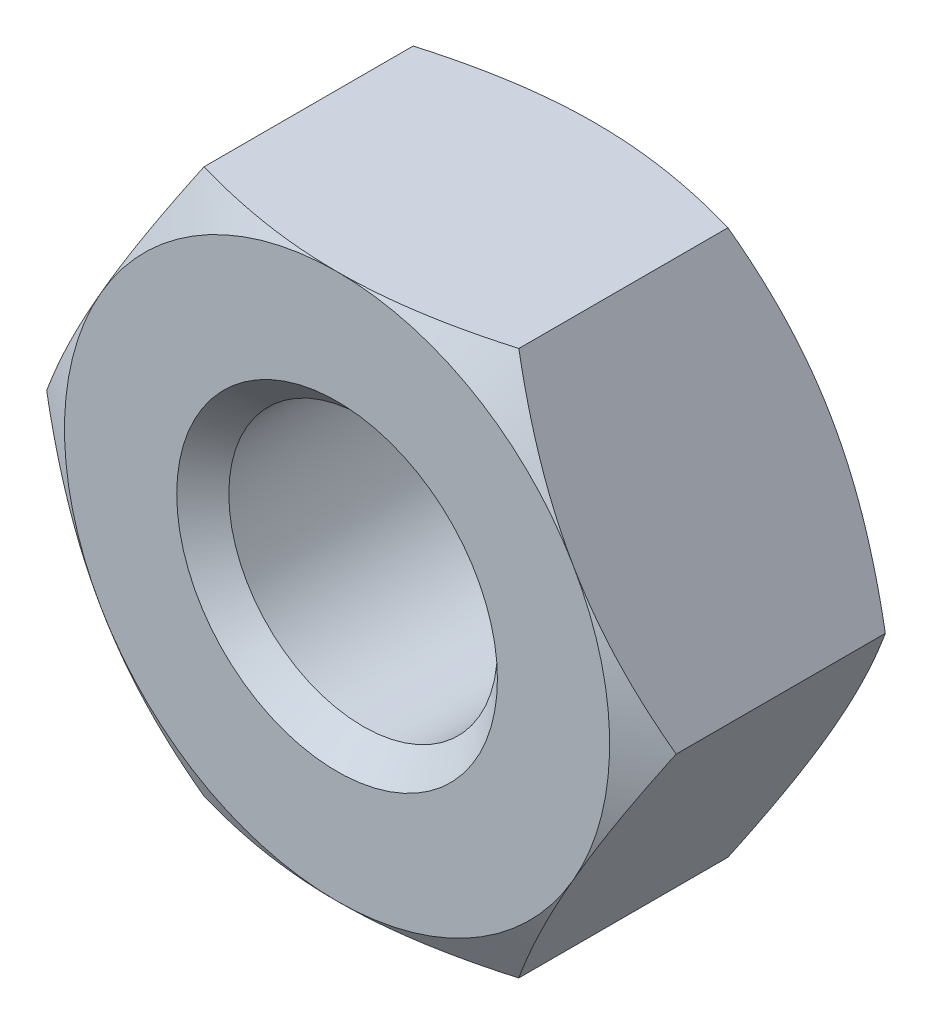
ISO-10303-21;
HEADER;
FILE_DESCRIPTION(('STEP AP214'),'2;1');
FILE_NAME('part.step','',(''),(''),'','','');
FILE_SCHEMA(('AUTOMOTIVE_DESIGN { 1 0 10303 214 1 1 1 1 }'));
ENDSEC;
DATA;
#1=APPLICATION_CONTEXT('core data for automotive mechanical design processes');
#2=APPLICATION_PROTOCOL_DEFINITION('international standard','automotive_design',2000,#1);
#3=PRODUCT_CONTEXT('',#1,'mechanical');
#4=PRODUCT('Part','Part','',(#3));
#5=PRODUCT_RELATED_PRODUCT_CATEGORY('part','',(#4));
#6=PRODUCT_DEFINITION_FORMATION('','',#4);
#7=PRODUCT_DEFINITION_CONTEXT('part definition',#1,'design');
#8=PRODUCT_DEFINITION('design','',#6,#7);
#9=PRODUCT_DEFINITION_SHAPE('','',#8);
#10=(LENGTH_UNIT() NAMED_UNIT(*) SI_UNIT(.MILLI.,.METRE.));
#11=(NAMED_UNIT(*) PLANE_ANGLE_UNIT() SI_UNIT($,.RADIAN.));
#12=(NAMED_UNIT(*) SI_UNIT($,.STERADIAN.) SOLID_ANGLE_UNIT());
#13=UNCERTAINTY_MEASURE_WITH_UNIT(LENGTH_MEASURE(1.E-05),#10,'distance_accuracy_value','');
#14=(GEOMETRIC_REPRESENTATION_CONTEXT(3) GLOBAL_UNCERTAINTY_ASSIGNED_CONTEXT((#13)) GLOBAL_UNIT_ASSIGNED_CONTEXT((#10,
#11,#12)) REPRESENTATION_CONTEXT('',''));
#15=CARTESIAN_POINT('',(0.,0.,0.));
#16=DIRECTION('',(0.,0.,1.));
#17=DIRECTION('',(1.,0.,0.));
#18=AXIS2_PLACEMENT_3D('',#15,#16,#17);
#19=CARTESIAN_POINT('',(0.,0.,0.380329489828666));
#20=DIRECTION('',(0.,0.,1.));
#21=DIRECTION('',(1.,0.,0.));
#22=AXIS2_PLACEMENT_3D('',#19,#20,#21);
#23=CONICAL_SURFACE('',#22,9.15875,1.0471975511966);
#24=CARTESIAN_POINT('',(4.91256615731534,-8.5,0.760658979657333));
#25=CARTESIAN_POINT('',(2.27961306603961,-8.5,0.));
#26=CARTESIAN_POINT('',(0.,-8.5,0.));
#27=CARTESIAN_POINT('',(-2.27961306603961,-8.5,0.));
#28=CARTESIAN_POINT('',(-4.91256615731535,-8.5,0.760658979657333));
#29=(BOUNDED_CURVE() B_SPLINE_CURVE(2,(#24,#25,#26,#27,#28),.UNSPECIFIED.,.F.,
.F.) B_SPLINE_CURVE_WITH_KNOTS((3,2,3),(0.,4.98381893788708,9.96763787577415),
.UNSPECIFIED.) CURVE() GEOMETRIC_REPRESENTATION_ITEM() RATIONAL_B_SPLINE_CURVE((1.,
1.03802697460134,1.,1.03802697460135,1.)) REPRESENTATION_ITEM(''));
#30=CARTESIAN_POINT('',(4.90747728811182,-8.5,0.759189378554847));
#31=VERTEX_POINT('',#30);
#32=CARTESIAN_POINT('',(0.,-8.5,0.));
#33=VERTEX_POINT('',#32);
#34=EDGE_CURVE('E193',#31,#33,#29,.T.);
#35=ORIENTED_EDGE('',*,*,#34,.T.);
#36=CARTESIAN_POINT('',(0.,0.,0.));
#37=DIRECTION('',(0.,0.,1.));
#38=DIRECTION('',(1.,0.,0.));
#39=AXIS2_PLACEMENT_3D('',#36,#37,#38);
#40=CIRCLE('',#39,8.5);
#41=CARTESIAN_POINT('',(7.36121593216773,-4.25,0.));
#42=VERTEX_POINT('',#41);
#43=EDGE_CURVE('E439',#33,#42,#40,.T.);
#44=ORIENTED_EDGE('',*,*,#43,.T.);
#45=CARTESIAN_POINT('',(9.8174990108254,0.00440709000678444,0.760658979657332));
#46=CARTESIAN_POINT('',(8.50102246518754,-2.27579717401077,0.));
#47=CARTESIAN_POINT('',(7.36121593216773,-4.25,0.));
#48=CARTESIAN_POINT('',(6.22140939914793,-6.22420282598924,0.));
#49=CARTESIAN_POINT('',(4.90493285351006,-8.50440709000679,0.760658979657332));
#50=(BOUNDED_CURVE() B_SPLINE_CURVE(2,(#45,#46,#47,#48,#49),.UNSPECIFIED.,.F.,
.F.) B_SPLINE_CURVE_WITH_KNOTS((3,2,3),(0.,4.98381893788707,9.96763787577414),
.UNSPECIFIED.) CURVE() GEOMETRIC_REPRESENTATION_ITEM() RATIONAL_B_SPLINE_CURVE((1.,
1.03802697460133,1.,1.03802697460134,1.)) REPRESENTATION_ITEM(''));
#51=EDGE_CURVE('E322',#42,#31,#50,.T.);
#52=ORIENTED_EDGE('',*,*,#51,.T.);
#53=EDGE_LOOP('',(#35,#44,#52));
#54=FACE_BOUND('',#53,.T.);
#55=ADVANCED_FACE('F17',(#54),#23,.T.);
#56=CARTESIAN_POINT('',(0.,0.,0.380329489828666));
#57=DIRECTION('',(0.,0.,1.));
#58=DIRECTION('',(1.,0.,0.));
#59=AXIS2_PLACEMENT_3D('',#56,#57,#58);
#60=CONICAL_SURFACE('',#59,9.15875,1.0471975511966);
#61=CARTESIAN_POINT('',(-4.90493285351006,-8.50440709000678,0.760658979657332));
#62=CARTESIAN_POINT('',(-6.22140939914794,-6.22420282598923,0.));
#63=CARTESIAN_POINT('',(-7.36121593216773,-4.25,0.));
#64=CARTESIAN_POINT('',(-8.50102246518752,-2.27579717401077,0.));
#65=CARTESIAN_POINT('',(-9.8174990108254,0.00440709000678777,0.760658979657331));
#66=(BOUNDED_CURVE() B_SPLINE_CURVE(2,(#61,#62,#63,#64,#65),.UNSPECIFIED.,.F.,
.F.) B_SPLINE_CURVE_WITH_KNOTS((3,2,3),(0.,4.98381893788707,9.96763787577413),
.UNSPECIFIED.) CURVE() GEOMETRIC_REPRESENTATION_ITEM() RATIONAL_B_SPLINE_CURVE((1.,
1.03802697460134,1.,1.03802697460134,1.)) REPRESENTATION_ITEM(''));
#67=CARTESIAN_POINT('',(-4.90747728811183,-8.5,0.759189378554847));
#68=VERTEX_POINT('',#67);
#69=CARTESIAN_POINT('',(-7.36121593216773,-4.25,0.));
#70=VERTEX_POINT('',#69);
#71=EDGE_CURVE('E363',#68,#70,#66,.T.);
#72=ORIENTED_EDGE('',*,*,#71,.T.);
#73=CARTESIAN_POINT('',(0.,0.,0.));
#74=DIRECTION('',(0.,0.,1.));
#75=DIRECTION('',(1.,0.,0.));
#76=AXIS2_PLACEMENT_3D('',#73,#74,#75);
#77=CIRCLE('',#76,8.5);
#78=EDGE_CURVE('E436',#70,#33,#77,.T.);
#79=ORIENTED_EDGE('',*,*,#78,.T.);
#80=CARTESIAN_POINT('',(4.91256615731534,-8.5,0.760658979657333));
#81=CARTESIAN_POINT('',(2.27961306603961,-8.5,0.));
#82=CARTESIAN_POINT('',(0.,-8.5,0.));
#83=CARTESIAN_POINT('',(-2.27961306603961,-8.5,0.));
#84=CARTESIAN_POINT('',(-4.91256615731535,-8.5,0.760658979657333));
#85=(BOUNDED_CURVE() B_SPLINE_CURVE(2,(#80,#81,#82,#83,#84),.UNSPECIFIED.,.F.,
.F.) B_SPLINE_CURVE_WITH_KNOTS((3,2,3),(0.,4.98381893788708,9.96763787577415),
.UNSPECIFIED.) CURVE() GEOMETRIC_REPRESENTATION_ITEM() RATIONAL_B_SPLINE_CURVE((1.,
1.03802697460134,1.,1.03802697460135,1.)) REPRESENTATION_ITEM(''));
#86=EDGE_CURVE('E47',#33,#68,#85,.T.);
#87=ORIENTED_EDGE('',*,*,#86,.T.);
#88=EDGE_LOOP('',(#72,#79,#87));
#89=FACE_BOUND('',#88,.T.);
#90=ADVANCED_FACE('F437',(#89),#60,.T.);
#91=CARTESIAN_POINT('',(0.,0.,0.380329489828666));
#92=DIRECTION('',(0.,0.,1.));
#93=DIRECTION('',(1.,0.,0.));
#94=AXIS2_PLACEMENT_3D('',#91,#92,#93);
#95=CONICAL_SURFACE('',#94,9.15875,1.0471975511966);
#96=CARTESIAN_POINT('',(-9.8174990108254,-0.00440709000678577,0.760658979657332));
#97=CARTESIAN_POINT('',(-8.50102246518754,2.27579717401076,0.));
#98=CARTESIAN_POINT('',(-7.36121593216773,4.25,0.));
#99=CARTESIAN_POINT('',(-6.22140939914792,6.22420282598924,0.));
#100=CARTESIAN_POINT('',(-4.90493285351005,8.50440709000679,0.760658979657331));
#101=(BOUNDED_CURVE() B_SPLINE_CURVE(2,(#96,#97,#98,#99,#100),.UNSPECIFIED.,.F.,
.F.) B_SPLINE_CURVE_WITH_KNOTS((3,2,3),(0.,4.98381893788707,9.96763787577414),
.UNSPECIFIED.) CURVE() GEOMETRIC_REPRESENTATION_ITEM() RATIONAL_B_SPLINE_CURVE((1.,
1.03802697460133,1.,1.03802697460134,1.)) REPRESENTATION_ITEM(''));
#102=CARTESIAN_POINT('',(-9.81495457622364,0.,0.759189378554847));
#103=VERTEX_POINT('',#102);
#104=CARTESIAN_POINT('',(-7.36121593216773,4.25,0.));
#105=VERTEX_POINT('',#104);
#106=EDGE_CURVE('E266',#103,#105,#101,.T.);
#107=ORIENTED_EDGE('',*,*,#106,.T.);
#108=CARTESIAN_POINT('',(0.,0.,0.));
#109=DIRECTION('',(0.,0.,1.));
#110=DIRECTION('',(1.,0.,0.));
#111=AXIS2_PLACEMENT_3D('',#108,#109,#110);
#112=CIRCLE('',#111,8.5);
#113=EDGE_CURVE('E185',#105,#70,#112,.T.);
#114=ORIENTED_EDGE('',*,*,#113,.T.);
#115=CARTESIAN_POINT('',(-4.90493285351006,-8.50440709000678,0.760658979657332));
#116=CARTESIAN_POINT('',(-6.22140939914794,-6.22420282598923,0.));
#117=CARTESIAN_POINT('',(-7.36121593216773,-4.25,0.));
#118=CARTESIAN_POINT('',(-8.50102246518752,-2.27579717401077,0.));
#119=CARTESIAN_POINT('',(-9.8174990108254,0.00440709000678777,0.760658979657331));
#120=(BOUNDED_CURVE() B_SPLINE_CURVE(2,(#115,#116,#117,#118,#119),.UNSPECIFIED.,.F.,
.F.) B_SPLINE_CURVE_WITH_KNOTS((3,2,3),(0.,4.98381893788707,9.96763787577413),
.UNSPECIFIED.) CURVE() GEOMETRIC_REPRESENTATION_ITEM() RATIONAL_B_SPLINE_CURVE((1.,
1.03802697460134,1.,1.03802697460134,1.)) REPRESENTATION_ITEM(''));
#121=EDGE_CURVE('E294',#70,#103,#120,.T.);
#122=ORIENTED_EDGE('',*,*,#121,.T.);
#123=EDGE_LOOP('',(#107,#114,#122));
#124=FACE_BOUND('',#123,.T.);
#125=ADVANCED_FACE('F476',(#124),#95,.T.);
#126=CARTESIAN_POINT('',(0.,0.,0.380329489828666));
#127=DIRECTION('',(0.,0.,1.));
#128=DIRECTION('',(1.,0.,0.));
#129=AXIS2_PLACEMENT_3D('',#126,#127,#128);
#130=CONICAL_SURFACE('',#129,9.15875,1.0471975511966);
#131=CARTESIAN_POINT('',(-9.8174990108254,-0.00440709000678577,0.760658979657332));
#132=CARTESIAN_POINT('',(-8.50102246518754,2.27579717401076,0.));
#133=CARTESIAN_POINT('',(-7.36121593216773,4.25,0.));
#134=CARTESIAN_POINT('',(-6.22140939914792,6.22420282598924,0.));
#135=CARTESIAN_POINT('',(-4.90493285351005,8.50440709000679,0.760658979657331));
#136=(BOUNDED_CURVE() B_SPLINE_CURVE(2,(#131,#132,#133,#134,#135),.UNSPECIFIED.,.F.,
.F.) B_SPLINE_CURVE_WITH_KNOTS((3,2,3),(0.,4.98381893788707,9.96763787577414),
.UNSPECIFIED.) CURVE() GEOMETRIC_REPRESENTATION_ITEM() RATIONAL_B_SPLINE_CURVE((1.,
1.03802697460133,1.,1.03802697460134,1.)) REPRESENTATION_ITEM(''));
#137=CARTESIAN_POINT('',(-4.90747728811182,8.5,0.759189378554845));
#138=VERTEX_POINT('',#137);
#139=EDGE_CURVE('E314',#105,#138,#136,.T.);
#140=ORIENTED_EDGE('',*,*,#139,.T.);
#141=CARTESIAN_POINT('',(-4.91256615731534,8.5,0.760658979657332));
#142=CARTESIAN_POINT('',(-2.2796130660396,8.5,0.));
#143=CARTESIAN_POINT('',(0.,8.5,0.));
#144=CARTESIAN_POINT('',(2.2796130660396,8.5,0.));
#145=CARTESIAN_POINT('',(4.91256615731534,8.5,0.760658979657332));
#146=(BOUNDED_CURVE() B_SPLINE_CURVE(2,(#141,#142,#143,#144,#145),.UNSPECIFIED.,.F.,
.F.) B_SPLINE_CURVE_WITH_KNOTS((3,2,3),(0.,4.98381893788707,9.96763787577414),
.UNSPECIFIED.) CURVE() GEOMETRIC_REPRESENTATION_ITEM() RATIONAL_B_SPLINE_CURVE((1.,
1.03802697460133,1.,1.03802697460133,1.)) REPRESENTATION_ITEM(''));
#147=CARTESIAN_POINT('',(0.,8.5,0.));
#148=VERTEX_POINT('',#147);
#149=EDGE_CURVE('E149',#138,#148,#146,.T.);
#150=ORIENTED_EDGE('',*,*,#149,.T.);
#151=CARTESIAN_POINT('',(0.,0.,0.));
#152=DIRECTION('',(0.,0.,1.));
#153=DIRECTION('',(1.,0.,0.));
#154=AXIS2_PLACEMENT_3D('',#151,#152,#153);
#155=CIRCLE('',#154,8.5);
#156=EDGE_CURVE('E178',#148,#105,#155,.T.);
#157=ORIENTED_EDGE('',*,*,#156,.T.);
#158=EDGE_LOOP('',(#140,#150,#157));
#159=FACE_BOUND('',#158,.T.);
#160=ADVANCED_FACE('F481',(#159),#130,.T.);
#161=CARTESIAN_POINT('',(0.,0.,0.380329489828666));
#162=DIRECTION('',(0.,0.,1.));
#163=DIRECTION('',(1.,0.,0.));
#164=AXIS2_PLACEMENT_3D('',#161,#162,#163);
#165=CONICAL_SURFACE('',#164,9.15875,1.0471975511966);
#166=CARTESIAN_POINT('',(-4.91256615731534,8.5,0.760658979657332));
#167=CARTESIAN_POINT('',(-2.2796130660396,8.5,0.));
#168=CARTESIAN_POINT('',(0.,8.5,0.));
#169=CARTESIAN_POINT('',(2.2796130660396,8.5,0.));
#170=CARTESIAN_POINT('',(4.91256615731534,8.5,0.760658979657332));
#171=(BOUNDED_CURVE() B_SPLINE_CURVE(2,(#166,#167,#168,#169,#170),.UNSPECIFIED.,.F.,
.F.) B_SPLINE_CURVE_WITH_KNOTS((3,2,3),(0.,4.98381893788707,9.96763787577414),
.UNSPECIFIED.) CURVE() GEOMETRIC_REPRESENTATION_ITEM() RATIONAL_B_SPLINE_CURVE((1.,
1.03802697460133,1.,1.03802697460133,1.)) REPRESENTATION_ITEM(''));
#172=CARTESIAN_POINT('',(4.90747728811182,8.5,0.759189378554847));
#173=VERTEX_POINT('',#172);
#174=EDGE_CURVE('E157',#148,#173,#171,.T.);
#175=ORIENTED_EDGE('',*,*,#174,.T.);
#176=CARTESIAN_POINT('',(4.90493285351006,8.50440709000679,0.760658979657332));
#177=CARTESIAN_POINT('',(6.22140939914792,6.22420282598924,0.));
#178=CARTESIAN_POINT('',(7.36121593216773,4.25,0.));
#179=CARTESIAN_POINT('',(8.50102246518754,2.27579717401077,0.));
#180=CARTESIAN_POINT('',(9.8174990108254,-0.00440709000678673,0.760658979657331));
#181=(BOUNDED_CURVE() B_SPLINE_CURVE(2,(#176,#177,#178,#179,#180),.UNSPECIFIED.,.F.,
.F.) B_SPLINE_CURVE_WITH_KNOTS((3,2,3),(0.,4.98381893788707,9.96763787577414),
.UNSPECIFIED.) CURVE() GEOMETRIC_REPRESENTATION_ITEM() RATIONAL_B_SPLINE_CURVE((1.,
1.03802697460133,1.,1.03802697460133,1.)) REPRESENTATION_ITEM(''));
#182=CARTESIAN_POINT('',(7.36121593216773,4.25,0.));
#183=VERTEX_POINT('',#182);
#184=EDGE_CURVE('E142',#173,#183,#181,.T.);
#185=ORIENTED_EDGE('',*,*,#184,.T.);
#186=CARTESIAN_POINT('',(0.,0.,0.));
#187=DIRECTION('',(0.,0.,1.));
#188=DIRECTION('',(1.,0.,0.));
#189=AXIS2_PLACEMENT_3D('',#186,#187,#188);
#190=CIRCLE('',#189,8.5);
#191=EDGE_CURVE('E155',#183,#148,#190,.T.);
#192=ORIENTED_EDGE('',*,*,#191,.T.);
#193=EDGE_LOOP('',(#175,#185,#192));
#194=FACE_BOUND('',#193,.T.);
#195=ADVANCED_FACE('F153',(#194),#165,.T.);
#196=CARTESIAN_POINT('',(0.,0.,0.380329489828666));
#197=DIRECTION('',(0.,0.,1.));
#198=DIRECTION('',(1.,0.,0.));
#199=AXIS2_PLACEMENT_3D('',#196,#197,#198);
#200=CONICAL_SURFACE('',#199,9.15875,1.0471975511966);
#201=CARTESIAN_POINT('',(4.90493285351006,8.50440709000679,0.760658979657332));
#202=CARTESIAN_POINT('',(6.22140939914792,6.22420282598924,0.));
#203=CARTESIAN_POINT('',(7.36121593216773,4.25,0.));
#204=CARTESIAN_POINT('',(8.50102246518754,2.27579717401077,0.));
#205=CARTESIAN_POINT('',(9.8174990108254,-0.00440709000678673,0.760658979657331));
#206=(BOUNDED_CURVE() B_SPLINE_CURVE(2,(#201,#202,#203,#204,#205),.UNSPECIFIED.,.F.,
.F.) B_SPLINE_CURVE_WITH_KNOTS((3,2,3),(0.,4.98381893788707,9.96763787577414),
.UNSPECIFIED.) CURVE() GEOMETRIC_REPRESENTATION_ITEM() RATIONAL_B_SPLINE_CURVE((1.,
1.03802697460133,1.,1.03802697460133,1.)) REPRESENTATION_ITEM(''));
#207=CARTESIAN_POINT('',(9.81495457622364,0.,0.759189378554847));
#208=VERTEX_POINT('',#207);
#209=EDGE_CURVE('E138',#183,#208,#206,.T.);
#210=ORIENTED_EDGE('',*,*,#209,.T.);
#211=CARTESIAN_POINT('',(9.8174990108254,0.00440709000678444,0.760658979657332));
#212=CARTESIAN_POINT('',(8.50102246518754,-2.27579717401077,0.));
#213=CARTESIAN_POINT('',(7.36121593216773,-4.25,0.));
#214=CARTESIAN_POINT('',(6.22140939914793,-6.22420282598924,0.));
#215=CARTESIAN_POINT('',(4.90493285351006,-8.50440709000679,0.760658979657332));
#216=(BOUNDED_CURVE() B_SPLINE_CURVE(2,(#211,#212,#213,#214,#215),.UNSPECIFIED.,.F.,
.F.) B_SPLINE_CURVE_WITH_KNOTS((3,2,3),(0.,4.98381893788707,9.96763787577414),
.UNSPECIFIED.) CURVE() GEOMETRIC_REPRESENTATION_ITEM() RATIONAL_B_SPLINE_CURVE((1.,
1.03802697460133,1.,1.03802697460134,1.)) REPRESENTATION_ITEM(''));
#217=EDGE_CURVE('E166',#208,#42,#216,.T.);
#218=ORIENTED_EDGE('',*,*,#217,.T.);
#219=CARTESIAN_POINT('',(0.,0.,0.));
#220=DIRECTION('',(0.,0.,1.));
#221=DIRECTION('',(1.,0.,0.));
#222=AXIS2_PLACEMENT_3D('',#219,#220,#221);
#223=CIRCLE('',#222,8.5);
#224=EDGE_CURVE('E164',#42,#183,#223,.T.);
#225=ORIENTED_EDGE('',*,*,#224,.T.);
#226=EDGE_LOOP('',(#210,#218,#225));
#227=FACE_BOUND('',#226,.T.);
#228=ADVANCED_FACE('F165',(#227),#200,.T.);
#229=CARTESIAN_POINT('',(0.,0.,7.65967051017133));
#230=DIRECTION('',(0.,0.,-1.));
#231=DIRECTION('',(1.,0.,0.));
#232=AXIS2_PLACEMENT_3D('',#229,#230,#231);
#233=CONICAL_SURFACE('',#232,9.15875,1.0471975511966);
#234=CARTESIAN_POINT('',(-4.90493285351006,8.50440709000679,7.27934102034267));
#235=CARTESIAN_POINT('',(-6.22140939914793,6.22420282598923,8.04));
#236=CARTESIAN_POINT('',(-7.36121593216773,4.25,8.04));
#237=CARTESIAN_POINT('',(-8.50102246518754,2.27579717401078,8.04000000000001));
#238=CARTESIAN_POINT('',(-9.8174990108254,-0.00440709000678251,7.27934102034267));
#239=(BOUNDED_CURVE() B_SPLINE_CURVE(2,(#234,#235,#236,#237,#238),.UNSPECIFIED.,.F.,
.F.) B_SPLINE_CURVE_WITH_KNOTS((3,2,3),(0.,4.98381893788707,9.96763787577413),
.UNSPECIFIED.) CURVE() GEOMETRIC_REPRESENTATION_ITEM() RATIONAL_B_SPLINE_CURVE((1.,
1.03802697460135,1.,1.03802697460132,1.)) REPRESENTATION_ITEM(''));
#240=CARTESIAN_POINT('',(-4.90747728811182,8.5,7.28081062144515));
#241=VERTEX_POINT('',#240);
#242=CARTESIAN_POINT('',(-7.36121593216773,4.25,8.04));
#243=VERTEX_POINT('',#242);
#244=EDGE_CURVE('E306',#241,#243,#239,.T.);
#245=ORIENTED_EDGE('',*,*,#244,.T.);
#246=CARTESIAN_POINT('',(0.,0.,8.04));
#247=DIRECTION('',(0.,0.,-1.));
#248=DIRECTION('',(1.,0.,0.));
#249=AXIS2_PLACEMENT_3D('',#246,#247,#248);
#250=CIRCLE('',#249,8.5);
#251=CARTESIAN_POINT('',(0.,8.5,8.04));
#252=VERTEX_POINT('',#251);
#253=EDGE_CURVE('E203',#243,#252,#250,.T.);
#254=ORIENTED_EDGE('',*,*,#253,.T.);
#255=CARTESIAN_POINT('',(4.91256615731534,8.5,7.27934102034267));
#256=CARTESIAN_POINT('',(2.2796130660396,8.49999999999999,8.03999999999999));
#257=CARTESIAN_POINT('',(0.,8.5,8.04));
#258=CARTESIAN_POINT('',(-2.2796130660396,8.49999999999999,8.03999999999999));
#259=CARTESIAN_POINT('',(-4.91256615731534,8.5,7.27934102034267));
#260=(BOUNDED_CURVE() B_SPLINE_CURVE(2,(#255,#256,#257,#258,#259),.UNSPECIFIED.,.F.,
.F.) B_SPLINE_CURVE_WITH_KNOTS((3,2,3),(0.,4.98381893788707,9.96763787577414),
.UNSPECIFIED.) CURVE() GEOMETRIC_REPRESENTATION_ITEM() RATIONAL_B_SPLINE_CURVE((1.,
1.03802697460134,1.,1.03802697460134,1.)) REPRESENTATION_ITEM(''));
#261=EDGE_CURVE('E274',#252,#241,#260,.T.);
#262=ORIENTED_EDGE('',*,*,#261,.T.);
#263=EDGE_LOOP('',(#245,#254,#262));
#264=FACE_BOUND('',#263,.T.);
#265=ADVANCED_FACE('F514',(#264),#233,.T.);
#266=CARTESIAN_POINT('',(0.,0.,7.65967051017133));
#267=DIRECTION('',(0.,0.,-1.));
#268=DIRECTION('',(1.,0.,0.));
#269=AXIS2_PLACEMENT_3D('',#266,#267,#268);
#270=CONICAL_SURFACE('',#269,9.15875,1.0471975511966);
#271=CARTESIAN_POINT('',(-9.8174990108254,0.00440709000679198,7.27934102034267));
#272=CARTESIAN_POINT('',(-8.50102246518752,-2.27579717401076,8.03999999999999));
#273=CARTESIAN_POINT('',(-7.36121593216773,-4.25,8.04));
#274=CARTESIAN_POINT('',(-6.22140939914792,-6.22420282598923,8.04));
#275=CARTESIAN_POINT('',(-4.90493285351006,-8.50440709000679,7.27934102034267));
#276=(BOUNDED_CURVE() B_SPLINE_CURVE(2,(#271,#272,#273,#274,#275),.UNSPECIFIED.,.F.,
.F.) B_SPLINE_CURVE_WITH_KNOTS((3,2,3),(0.,4.98381893788707,9.96763787577414),
.UNSPECIFIED.) CURVE() GEOMETRIC_REPRESENTATION_ITEM() RATIONAL_B_SPLINE_CURVE((1.,
1.03802697460134,1.,1.03802697460132,1.)) REPRESENTATION_ITEM(''));
#277=CARTESIAN_POINT('',(-9.81495457622364,0.,7.28081062144515));
#278=VERTEX_POINT('',#277);
#279=CARTESIAN_POINT('',(-7.36121593216773,-4.25,8.04));
#280=VERTEX_POINT('',#279);
#281=EDGE_CURVE('E383',#278,#280,#276,.T.);
#282=ORIENTED_EDGE('',*,*,#281,.T.);
#283=CARTESIAN_POINT('',(0.,0.,8.04));
#284=DIRECTION('',(0.,0.,-1.));
#285=DIRECTION('',(1.,0.,0.));
#286=AXIS2_PLACEMENT_3D('',#283,#284,#285);
#287=CIRCLE('',#286,8.5);
#288=EDGE_CURVE('E207',#280,#243,#287,.T.);
#289=ORIENTED_EDGE('',*,*,#288,.T.);
#290=CARTESIAN_POINT('',(-4.90493285351006,8.50440709000679,7.27934102034267));
#291=CARTESIAN_POINT('',(-6.22140939914793,6.22420282598923,8.04));
#292=CARTESIAN_POINT('',(-7.36121593216773,4.25,8.04));
#293=CARTESIAN_POINT('',(-8.50102246518754,2.27579717401078,8.04000000000001));
#294=CARTESIAN_POINT('',(-9.8174990108254,-0.00440709000678251,7.27934102034267));
#295=(BOUNDED_CURVE() B_SPLINE_CURVE(2,(#290,#291,#292,#293,#294),.UNSPECIFIED.,.F.,
.F.) B_SPLINE_CURVE_WITH_KNOTS((3,2,3),(0.,4.98381893788707,9.96763787577413),
.UNSPECIFIED.) CURVE() GEOMETRIC_REPRESENTATION_ITEM() RATIONAL_B_SPLINE_CURVE((1.,
1.03802697460135,1.,1.03802697460132,1.)) REPRESENTATION_ITEM(''));
#296=EDGE_CURVE('E300',#243,#278,#295,.T.);
#297=ORIENTED_EDGE('',*,*,#296,.T.);
#298=EDGE_LOOP('',(#282,#289,#297));
#299=FACE_BOUND('',#298,.T.);
#300=ADVANCED_FACE('F427',(#299),#270,.T.);
#301=CARTESIAN_POINT('',(0.,0.,7.65967051017133));
#302=DIRECTION('',(0.,0.,-1.));
#303=DIRECTION('',(1.,0.,0.));
#304=AXIS2_PLACEMENT_3D('',#301,#302,#303);
#305=CONICAL_SURFACE('',#304,9.15875,1.0471975511966);
#306=CARTESIAN_POINT('',(-4.91256615731535,-8.5,7.27934102034267));
#307=CARTESIAN_POINT('',(-2.27961306603961,-8.49999999999999,8.04));
#308=CARTESIAN_POINT('',(0.,-8.5,8.04));
#309=CARTESIAN_POINT('',(2.27961306603961,-8.50000000000001,8.04000000000001));
#310=CARTESIAN_POINT('',(4.91256615731534,-8.5,7.27934102034267));
#311=(BOUNDED_CURVE() B_SPLINE_CURVE(2,(#306,#307,#308,#309,#310),.UNSPECIFIED.,.F.,
.F.) B_SPLINE_CURVE_WITH_KNOTS((3,2,3),(0.,4.98381893788707,9.96763787577414),
.UNSPECIFIED.) CURVE() GEOMETRIC_REPRESENTATION_ITEM() RATIONAL_B_SPLINE_CURVE((1.,
1.03802697460134,1.,1.03802697460133,1.)) REPRESENTATION_ITEM(''));
#312=CARTESIAN_POINT('',(-4.90747728811183,-8.5,7.28081062144515));
#313=VERTEX_POINT('',#312);
#314=CARTESIAN_POINT('',(0.,-8.5,8.04));
#315=VERTEX_POINT('',#314);
#316=EDGE_CURVE('E37',#313,#315,#311,.T.);
#317=ORIENTED_EDGE('',*,*,#316,.T.);
#318=CARTESIAN_POINT('',(0.,0.,8.04));
#319=DIRECTION('',(0.,0.,-1.));
#320=DIRECTION('',(1.,0.,0.));
#321=AXIS2_PLACEMENT_3D('',#318,#319,#320);
#322=CIRCLE('',#321,8.5);
#323=EDGE_CURVE('E214',#315,#280,#322,.T.);
#324=ORIENTED_EDGE('',*,*,#323,.T.);
#325=CARTESIAN_POINT('',(-9.8174990108254,0.00440709000679198,7.27934102034267));
#326=CARTESIAN_POINT('',(-8.50102246518752,-2.27579717401076,8.03999999999999));
#327=CARTESIAN_POINT('',(-7.36121593216773,-4.25,8.04));
#328=CARTESIAN_POINT('',(-6.22140939914792,-6.22420282598923,8.04));
#329=CARTESIAN_POINT('',(-4.90493285351006,-8.50440709000679,7.27934102034267));
#330=(BOUNDED_CURVE() B_SPLINE_CURVE(2,(#325,#326,#327,#328,#329),.UNSPECIFIED.,.F.,
.F.) B_SPLINE_CURVE_WITH_KNOTS((3,2,3),(0.,4.98381893788707,9.96763787577414),
.UNSPECIFIED.) CURVE() GEOMETRIC_REPRESENTATION_ITEM() RATIONAL_B_SPLINE_CURVE((1.,
1.03802697460134,1.,1.03802697460132,1.)) REPRESENTATION_ITEM(''));
#331=EDGE_CURVE('E378',#280,#313,#330,.T.);
#332=ORIENTED_EDGE('',*,*,#331,.T.);
#333=EDGE_LOOP('',(#317,#324,#332));
#334=FACE_BOUND('',#333,.T.);
#335=ADVANCED_FACE('F409',(#334),#305,.T.);
#336=CARTESIAN_POINT('',(0.,0.,7.65967051017133));
#337=DIRECTION('',(0.,0.,-1.));
#338=DIRECTION('',(1.,0.,0.));
#339=AXIS2_PLACEMENT_3D('',#336,#337,#338);
#340=CONICAL_SURFACE('',#339,9.15875,1.0471975511966);
#341=CARTESIAN_POINT('',(-4.91256615731535,-8.5,7.27934102034267));
#342=CARTESIAN_POINT('',(-2.27961306603961,-8.49999999999999,8.04));
#343=CARTESIAN_POINT('',(0.,-8.5,8.04));
#344=CARTESIAN_POINT('',(2.27961306603961,-8.50000000000001,8.04000000000001));
#345=CARTESIAN_POINT('',(4.91256615731534,-8.5,7.27934102034267));
#346=(BOUNDED_CURVE() B_SPLINE_CURVE(2,(#341,#342,#343,#344,#345),.UNSPECIFIED.,.F.,
.F.) B_SPLINE_CURVE_WITH_KNOTS((3,2,3),(0.,4.98381893788707,9.96763787577414),
.UNSPECIFIED.) CURVE() GEOMETRIC_REPRESENTATION_ITEM() RATIONAL_B_SPLINE_CURVE((1.,
1.03802697460134,1.,1.03802697460133,1.)) REPRESENTATION_ITEM(''));
#347=CARTESIAN_POINT('',(4.90747728811182,-8.5,7.28081062144515));
#348=VERTEX_POINT('',#347);
#349=EDGE_CURVE('E189',#315,#348,#346,.T.);
#350=ORIENTED_EDGE('',*,*,#349,.T.);
#351=CARTESIAN_POINT('',(4.90493285351006,-8.50440709000679,7.27934102034267));
#352=CARTESIAN_POINT('',(6.22140939914793,-6.22420282598923,8.04));
#353=CARTESIAN_POINT('',(7.36121593216773,-4.25,8.04));
#354=CARTESIAN_POINT('',(8.50102246518753,-2.27579717401077,8.04));
#355=CARTESIAN_POINT('',(9.8174990108254,0.00440709000678483,7.27934102034267));
#356=(BOUNDED_CURVE() B_SPLINE_CURVE(2,(#351,#352,#353,#354,#355),.UNSPECIFIED.,.F.,
.F.) B_SPLINE_CURVE_WITH_KNOTS((3,2,3),(0.,4.98381893788707,9.96763787577414),
.UNSPECIFIED.) CURVE() GEOMETRIC_REPRESENTATION_ITEM() RATIONAL_B_SPLINE_CURVE((1.,
1.03802697460135,1.,1.03802697460135,1.)) REPRESENTATION_ITEM(''));
#357=CARTESIAN_POINT('',(7.36121593216773,-4.25,8.04));
#358=VERTEX_POINT('',#357);
#359=EDGE_CURVE('E295',#348,#358,#356,.T.);
#360=ORIENTED_EDGE('',*,*,#359,.T.);
#361=CARTESIAN_POINT('',(0.,0.,8.04));
#362=DIRECTION('',(0.,0.,-1.));
#363=DIRECTION('',(1.,0.,0.));
#364=AXIS2_PLACEMENT_3D('',#361,#362,#363);
#365=CIRCLE('',#364,8.5);
#366=EDGE_CURVE('E202',#358,#315,#365,.T.);
#367=ORIENTED_EDGE('',*,*,#366,.T.);
#368=EDGE_LOOP('',(#350,#360,#367));
#369=FACE_BOUND('',#368,.T.);
#370=ADVANCED_FACE('F418',(#369),#340,.T.);
#371=CARTESIAN_POINT('',(0.,0.,7.65967051017133));
#372=DIRECTION('',(0.,0.,-1.));
#373=DIRECTION('',(1.,0.,0.));
#374=AXIS2_PLACEMENT_3D('',#371,#372,#373);
#375=CONICAL_SURFACE('',#374,9.15875,1.0471975511966);
#376=CARTESIAN_POINT('',(4.90493285351006,-8.50440709000679,7.27934102034267));
#377=CARTESIAN_POINT('',(6.22140939914793,-6.22420282598923,8.04));
#378=CARTESIAN_POINT('',(7.36121593216773,-4.25,8.04));
#379=CARTESIAN_POINT('',(8.50102246518753,-2.27579717401077,8.04));
#380=CARTESIAN_POINT('',(9.8174990108254,0.00440709000678483,7.27934102034267));
#381=(BOUNDED_CURVE() B_SPLINE_CURVE(2,(#376,#377,#378,#379,#380),.UNSPECIFIED.,.F.,
.F.) B_SPLINE_CURVE_WITH_KNOTS((3,2,3),(0.,4.98381893788707,9.96763787577414),
.UNSPECIFIED.) CURVE() GEOMETRIC_REPRESENTATION_ITEM() RATIONAL_B_SPLINE_CURVE((1.,
1.03802697460135,1.,1.03802697460135,1.)) REPRESENTATION_ITEM(''));
#382=CARTESIAN_POINT('',(9.81495457622364,0.,7.28081062144515));
#383=VERTEX_POINT('',#382);
#384=EDGE_CURVE('E341',#358,#383,#381,.T.);
#385=ORIENTED_EDGE('',*,*,#384,.T.);
#386=CARTESIAN_POINT('',(9.8174990108254,-0.00440709000679061,7.27934102034267));
#387=CARTESIAN_POINT('',(8.50102246518753,2.27579717401076,8.03999999999999));
#388=CARTESIAN_POINT('',(7.36121593216773,4.25,8.04));
#389=CARTESIAN_POINT('',(6.22140939914792,6.22420282598923,8.04));
#390=CARTESIAN_POINT('',(4.90493285351006,8.50440709000679,7.27934102034267));
#391=(BOUNDED_CURVE() B_SPLINE_CURVE(2,(#386,#387,#388,#389,#390),.UNSPECIFIED.,.F.,
.F.) B_SPLINE_CURVE_WITH_KNOTS((3,2,3),(0.,4.98381893788707,9.96763787577414),
.UNSPECIFIED.) CURVE() GEOMETRIC_REPRESENTATION_ITEM() RATIONAL_B_SPLINE_CURVE((1.,
1.03802697460131,1.,1.03802697460133,1.)) REPRESENTATION_ITEM(''));
#392=CARTESIAN_POINT('',(7.36121593216773,4.25,8.04));
#393=VERTEX_POINT('',#392);
#394=EDGE_CURVE('E234',#383,#393,#391,.T.);
#395=ORIENTED_EDGE('',*,*,#394,.T.);
#396=CARTESIAN_POINT('',(0.,0.,8.04));
#397=DIRECTION('',(0.,0.,-1.));
#398=DIRECTION('',(1.,0.,0.));
#399=AXIS2_PLACEMENT_3D('',#396,#397,#398);
#400=CIRCLE('',#399,8.5);
#401=EDGE_CURVE('E198',#393,#358,#400,.T.);
#402=ORIENTED_EDGE('',*,*,#401,.T.);
#403=EDGE_LOOP('',(#385,#395,#402));
#404=FACE_BOUND('',#403,.T.);
#405=ADVANCED_FACE('F468',(#404),#375,.T.);
#406=CARTESIAN_POINT('',(0.,0.,7.65967051017133));
#407=DIRECTION('',(0.,0.,-1.));
#408=DIRECTION('',(1.,0.,0.));
#409=AXIS2_PLACEMENT_3D('',#406,#407,#408);
#410=CONICAL_SURFACE('',#409,9.15875,1.0471975511966);
#411=CARTESIAN_POINT('',(9.8174990108254,-0.00440709000679061,7.27934102034267));
#412=CARTESIAN_POINT('',(8.50102246518753,2.27579717401076,8.03999999999999));
#413=CARTESIAN_POINT('',(7.36121593216773,4.25,8.04));
#414=CARTESIAN_POINT('',(6.22140939914792,6.22420282598923,8.04));
#415=CARTESIAN_POINT('',(4.90493285351006,8.50440709000679,7.27934102034267));
#416=(BOUNDED_CURVE() B_SPLINE_CURVE(2,(#411,#412,#413,#414,#415),.UNSPECIFIED.,.F.,
.F.) B_SPLINE_CURVE_WITH_KNOTS((3,2,3),(0.,4.98381893788707,9.96763787577414),
.UNSPECIFIED.) CURVE() GEOMETRIC_REPRESENTATION_ITEM() RATIONAL_B_SPLINE_CURVE((1.,
1.03802697460131,1.,1.03802697460133,1.)) REPRESENTATION_ITEM(''));
#417=CARTESIAN_POINT('',(4.90747728811182,8.5,7.28081062144515));
#418=VERTEX_POINT('',#417);
#419=EDGE_CURVE('E226',#393,#418,#416,.T.);
#420=ORIENTED_EDGE('',*,*,#419,.T.);
#421=CARTESIAN_POINT('',(4.91256615731534,8.5,7.27934102034267));
#422=CARTESIAN_POINT('',(2.2796130660396,8.49999999999999,8.03999999999999));
#423=CARTESIAN_POINT('',(0.,8.5,8.04));
#424=CARTESIAN_POINT('',(-2.2796130660396,8.49999999999999,8.03999999999999));
#425=CARTESIAN_POINT('',(-4.91256615731534,8.5,7.27934102034267));
#426=(BOUNDED_CURVE() B_SPLINE_CURVE(2,(#421,#422,#423,#424,#425),.UNSPECIFIED.,.F.,
.F.) B_SPLINE_CURVE_WITH_KNOTS((3,2,3),(0.,4.98381893788707,9.96763787577414),
.UNSPECIFIED.) CURVE() GEOMETRIC_REPRESENTATION_ITEM() RATIONAL_B_SPLINE_CURVE((1.,
1.03802697460134,1.,1.03802697460134,1.)) REPRESENTATION_ITEM(''));
#427=EDGE_CURVE('E267',#418,#252,#426,.T.);
#428=ORIENTED_EDGE('',*,*,#427,.T.);
#429=CARTESIAN_POINT('',(0.,0.,8.04));
#430=DIRECTION('',(0.,0.,-1.));
#431=DIRECTION('',(1.,0.,0.));
#432=AXIS2_PLACEMENT_3D('',#429,#430,#431);
#433=CIRCLE('',#432,8.5);
#434=EDGE_CURVE('E161',#252,#393,#433,.T.);
#435=ORIENTED_EDGE('',*,*,#434,.T.);
#436=EDGE_LOOP('',(#420,#428,#435));
#437=FACE_BOUND('',#436,.T.);
#438=ADVANCED_FACE('F466',(#437),#410,.T.);
#439=CARTESIAN_POINT('',(0.,0.,7.6340625));
#440=DIRECTION('',(0.,0.,1.));
#441=DIRECTION('',(1.,0.,0.));
#442=AXIS2_PLACEMENT_3D('',#439,#440,#441);
#443=CONICAL_SURFACE('',#442,4.5940625,0.785398163397448);
#444=CARTESIAN_POINT('',(0.,0.,7.228125));
#445=DIRECTION('',(0.,0.,1.));
#446=DIRECTION('',(1.,0.,0.));
#447=AXIS2_PLACEMENT_3D('',#444,#445,#446);
#448=CIRCLE('',#447,4.188125);
#449=CARTESIAN_POINT('',(4.188125,0.,7.228125));
#450=VERTEX_POINT('',#449);
#451=EDGE_CURVE('E11',#450,#450,#448,.T.);
#452=ORIENTED_EDGE('',*,*,#451,.F.);
#453=EDGE_LOOP('',(#452));
#454=FACE_BOUND('',#453,.T.);
#455=CARTESIAN_POINT('',(0.,0.,8.04));
#456=DIRECTION('',(0.,0.,1.));
#457=DIRECTION('',(1.,0.,0.));
#458=AXIS2_PLACEMENT_3D('',#455,#456,#457);
#459=CIRCLE('',#458,5.);
#460=CARTESIAN_POINT('',(5.,0.,8.04));
#461=VERTEX_POINT('',#460);
#462=EDGE_CURVE('E172',#461,#461,#459,.T.);
#463=ORIENTED_EDGE('',*,*,#462,.T.);
#464=EDGE_LOOP('',(#463));
#465=FACE_BOUND('',#464,.T.);
#466=ADVANCED_FACE('F490',(#454,#465),#443,.F.);
#467=CARTESIAN_POINT('',(0.,0.,4.02));
#468=DIRECTION('',(0.,0.,-1.));
#469=DIRECTION('',(1.,0.,0.));
#470=AXIS2_PLACEMENT_3D('',#467,#468,#469);
#471=CYLINDRICAL_SURFACE('',#470,4.188125);
#472=CARTESIAN_POINT('',(0.,0.,0.811875));
#473=DIRECTION('',(0.,0.,1.));
#474=DIRECTION('',(1.,0.,0.));
#475=AXIS2_PLACEMENT_3D('',#472,#473,#474);
#476=CIRCLE('',#475,4.188125);
#477=CARTESIAN_POINT('',(4.188125,0.,0.811875));
#478=VERTEX_POINT('',#477);
#479=EDGE_CURVE('E25',#478,#478,#476,.T.);
#480=ORIENTED_EDGE('',*,*,#479,.F.);
#481=EDGE_LOOP('',(#480));
#482=FACE_BOUND('',#481,.T.);
#483=ORIENTED_EDGE('',*,*,#451,.T.);
#484=EDGE_LOOP('',(#483));
#485=FACE_BOUND('',#484,.T.);
#486=ADVANCED_FACE('F486',(#482,#485),#471,.F.);
#487=CARTESIAN_POINT('',(0.,0.,0.4059375));
#488=DIRECTION('',(0.,0.,-1.));
#489=DIRECTION('',(1.,0.,0.));
#490=AXIS2_PLACEMENT_3D('',#487,#488,#489);
#491=CONICAL_SURFACE('',#490,4.5940625,0.785398163397448);
#492=CARTESIAN_POINT('',(0.,0.,0.));
#493=DIRECTION('',(0.,0.,-1.));
#494=DIRECTION('',(1.,0.,0.));
#495=AXIS2_PLACEMENT_3D('',#492,#493,#494);
#496=CIRCLE('',#495,5.);
#497=CARTESIAN_POINT('',(5.,0.,0.));
#498=VERTEX_POINT('',#497);
#499=EDGE_CURVE('E443',#498,#498,#496,.T.);
#500=ORIENTED_EDGE('',*,*,#499,.T.);
#501=EDGE_LOOP('',(#500));
#502=FACE_BOUND('',#501,.T.);
#503=ORIENTED_EDGE('',*,*,#479,.T.);
#504=EDGE_LOOP('',(#503));
#505=FACE_BOUND('',#504,.T.);
#506=ADVANCED_FACE('F489',(#502,#505),#491,.F.);
#507=CARTESIAN_POINT('',(0.,-8.5,0.));
#508=DIRECTION('',(0.,-1.,0.));
#509=DIRECTION('',(-1.,0.,0.));
#510=AXIS2_PLACEMENT_3D('',#507,#508,#509);
#511=PLANE('',#510);
#512=ORIENTED_EDGE('',*,*,#86,.F.);
#513=ORIENTED_EDGE('',*,*,#34,.F.);
#514=DIRECTION('',(0.,0.,1.));
#515=VECTOR('',#514,1.);
#516=CARTESIAN_POINT('',(4.90747728811182,-8.5,0.));
#517=LINE('',#516,#515);
#518=EDGE_CURVE('E287',#31,#348,#517,.T.);
#519=ORIENTED_EDGE('',*,*,#518,.T.);
#520=ORIENTED_EDGE('',*,*,#349,.F.);
#521=ORIENTED_EDGE('',*,*,#316,.F.);
#522=DIRECTION('',(0.,0.,1.));
#523=VECTOR('',#522,1.);
#524=CARTESIAN_POINT('',(-4.90747728811183,-8.5,0.));
#525=LINE('',#524,#523);
#526=EDGE_CURVE('E371',#68,#313,#525,.T.);
#527=ORIENTED_EDGE('',*,*,#526,.F.);
#528=EDGE_LOOP('',(#512,#513,#519,#520,#521,#527));
#529=FACE_BOUND('',#528,.T.);
#530=ADVANCED_FACE('F413',(#529),#511,.T.);
#531=CARTESIAN_POINT('',(-7.36121593216773,-4.25,0.));
#532=DIRECTION('',(-0.866025403784439,-0.5,0.));
#533=DIRECTION('',(-0.5,0.866025403784439,0.));
#534=AXIS2_PLACEMENT_3D('',#531,#532,#533);
#535=PLANE('',#534);
#536=ORIENTED_EDGE('',*,*,#121,.F.);
#537=ORIENTED_EDGE('',*,*,#71,.F.);
#538=ORIENTED_EDGE('',*,*,#526,.T.);
#539=ORIENTED_EDGE('',*,*,#331,.F.);
#540=ORIENTED_EDGE('',*,*,#281,.F.);
#541=DIRECTION('',(0.,0.,1.));
#542=VECTOR('',#541,1.);
#543=CARTESIAN_POINT('',(-9.81495457622364,0.,0.));
#544=LINE('',#543,#542);
#545=EDGE_CURVE('E296',#103,#278,#544,.T.);
#546=ORIENTED_EDGE('',*,*,#545,.F.);
#547=EDGE_LOOP('',(#536,#537,#538,#539,#540,#546));
#548=FACE_BOUND('',#547,.T.);
#549=ADVANCED_FACE('F432',(#548),#535,.T.);
#550=CARTESIAN_POINT('',(7.36121593216773,-4.25,0.));
#551=DIRECTION('',(0.866025403784439,-0.5,0.));
#552=DIRECTION('',(0.,0.,-1.));
#553=AXIS2_PLACEMENT_3D('',#550,#551,#552);
#554=PLANE('',#553);
#555=ORIENTED_EDGE('',*,*,#51,.F.);
#556=ORIENTED_EDGE('',*,*,#217,.F.);
#557=DIRECTION('',(0.,0.,1.));
#558=VECTOR('',#557,1.);
#559=CARTESIAN_POINT('',(9.81495457622364,0.,0.));
#560=LINE('',#559,#558);
#561=EDGE_CURVE('E145',#208,#383,#560,.T.);
#562=ORIENTED_EDGE('',*,*,#561,.T.);
#563=ORIENTED_EDGE('',*,*,#384,.F.);
#564=ORIENTED_EDGE('',*,*,#359,.F.);
#565=ORIENTED_EDGE('',*,*,#518,.F.);
#566=EDGE_LOOP('',(#555,#556,#562,#563,#564,#565));
#567=FACE_BOUND('',#566,.T.);
#568=ADVANCED_FACE('F470',(#567),#554,.T.);
#569=CARTESIAN_POINT('',(-7.36121593216773,4.25,0.));
#570=DIRECTION('',(-0.866025403784439,0.5,0.));
#571=DIRECTION('',(0.,0.,1.));
#572=AXIS2_PLACEMENT_3D('',#569,#570,#571);
#573=PLANE('',#572);
#574=ORIENTED_EDGE('',*,*,#106,.F.);
#575=ORIENTED_EDGE('',*,*,#545,.T.);
#576=ORIENTED_EDGE('',*,*,#296,.F.);
#577=ORIENTED_EDGE('',*,*,#244,.F.);
#578=DIRECTION('',(0.,0.,1.));
#579=VECTOR('',#578,1.);
#580=CARTESIAN_POINT('',(-4.90747728811182,8.5,0.));
#581=LINE('',#580,#579);
#582=EDGE_CURVE('E258',#138,#241,#581,.T.);
#583=ORIENTED_EDGE('',*,*,#582,.F.);
#584=ORIENTED_EDGE('',*,*,#139,.F.);
#585=EDGE_LOOP('',(#574,#575,#576,#577,#583,#584));
#586=FACE_BOUND('',#585,.T.);
#587=ADVANCED_FACE('F492',(#586),#573,.T.);
#588=CARTESIAN_POINT('',(0.,8.5,0.));
#589=DIRECTION('',(0.,1.,0.));
#590=DIRECTION('',(0.,0.,-1.));
#591=AXIS2_PLACEMENT_3D('',#588,#589,#590);
#592=PLANE('',#591);
#593=ORIENTED_EDGE('',*,*,#149,.F.);
#594=ORIENTED_EDGE('',*,*,#582,.T.);
#595=ORIENTED_EDGE('',*,*,#261,.F.);
#596=ORIENTED_EDGE('',*,*,#427,.F.);
#597=DIRECTION('',(0.,0.,1.));
#598=VECTOR('',#597,1.);
#599=CARTESIAN_POINT('',(4.90747728811182,8.5,0.));
#600=LINE('',#599,#598);
#601=EDGE_CURVE('E160',#173,#418,#600,.T.);
#602=ORIENTED_EDGE('',*,*,#601,.F.);
#603=ORIENTED_EDGE('',*,*,#174,.F.);
#604=EDGE_LOOP('',(#593,#594,#595,#596,#602,#603));
#605=FACE_BOUND('',#604,.T.);
#606=ADVANCED_FACE('F463',(#605),#592,.T.);
#607=CARTESIAN_POINT('',(7.36121593216773,4.25,0.));
#608=DIRECTION('',(0.866025403784439,0.5,0.));
#609=DIRECTION('',(0.,0.,-1.));
#610=AXIS2_PLACEMENT_3D('',#607,#608,#609);
#611=PLANE('',#610);
#612=ORIENTED_EDGE('',*,*,#184,.F.);
#613=ORIENTED_EDGE('',*,*,#601,.T.);
#614=ORIENTED_EDGE('',*,*,#419,.F.);
#615=ORIENTED_EDGE('',*,*,#394,.F.);
#616=ORIENTED_EDGE('',*,*,#561,.F.);
#617=ORIENTED_EDGE('',*,*,#209,.F.);
#618=EDGE_LOOP('',(#612,#613,#614,#615,#616,#617));
#619=FACE_BOUND('',#618,.T.);
#620=ADVANCED_FACE('F140',(#619),#611,.T.);
#621=CARTESIAN_POINT('',(0.,0.,8.04));
#622=DIRECTION('',(0.,0.,1.));
#623=DIRECTION('',(0.,-1.,0.));
#624=AXIS2_PLACEMENT_3D('',#621,#622,#623);
#625=PLANE('',#624);
#626=ORIENTED_EDGE('',*,*,#253,.F.);
#627=ORIENTED_EDGE('',*,*,#288,.F.);
#628=ORIENTED_EDGE('',*,*,#323,.F.);
#629=ORIENTED_EDGE('',*,*,#366,.F.);
#630=ORIENTED_EDGE('',*,*,#401,.F.);
#631=ORIENTED_EDGE('',*,*,#434,.F.);
#632=EDGE_LOOP('',(#626,#627,#628,#629,#630,#631));
#633=FACE_BOUND('',#632,.T.);
#634=ORIENTED_EDGE('',*,*,#462,.F.);
#635=EDGE_LOOP('',(#634));
#636=FACE_BOUND('',#635,.T.);
#637=ADVANCED_FACE('F423',(#633,#636),#625,.T.);
#638=CARTESIAN_POINT('',(0.,0.,0.));
#639=DIRECTION('',(0.,0.,1.));
#640=DIRECTION('',(0.,-1.,0.));
#641=AXIS2_PLACEMENT_3D('',#638,#639,#640);
#642=PLANE('',#641);
#643=ORIENTED_EDGE('',*,*,#43,.F.);
#644=ORIENTED_EDGE('',*,*,#78,.F.);
#645=ORIENTED_EDGE('',*,*,#113,.F.);
#646=ORIENTED_EDGE('',*,*,#156,.F.);
#647=ORIENTED_EDGE('',*,*,#191,.F.);
#648=ORIENTED_EDGE('',*,*,#224,.F.);
#649=EDGE_LOOP('',(#643,#644,#645,#646,#647,#648));
#650=FACE_BOUND('',#649,.T.);
#651=ORIENTED_EDGE('',*,*,#499,.F.);
#652=EDGE_LOOP('',(#651));
#653=FACE_BOUND('',#652,.T.);
#654=ADVANCED_FACE('F174',(#650,#653),#642,.F.);
#655=CLOSED_SHELL('',(#55,#90,#125,#160,#195,#228,#265,#300,#335,#370,#405,#438,#466,#486,#506,
#530,#549,#568,#587,#606,#620,#637,#654));
#656=MANIFOLD_SOLID_BREP('B1',#655);
#657=ADVANCED_BREP_SHAPE_REPRESENTATION('',(#18,#656),#14);
#658=SHAPE_DEFINITION_REPRESENTATION(#9,#657);
ENDSEC;
END-ISO-10303-21;
